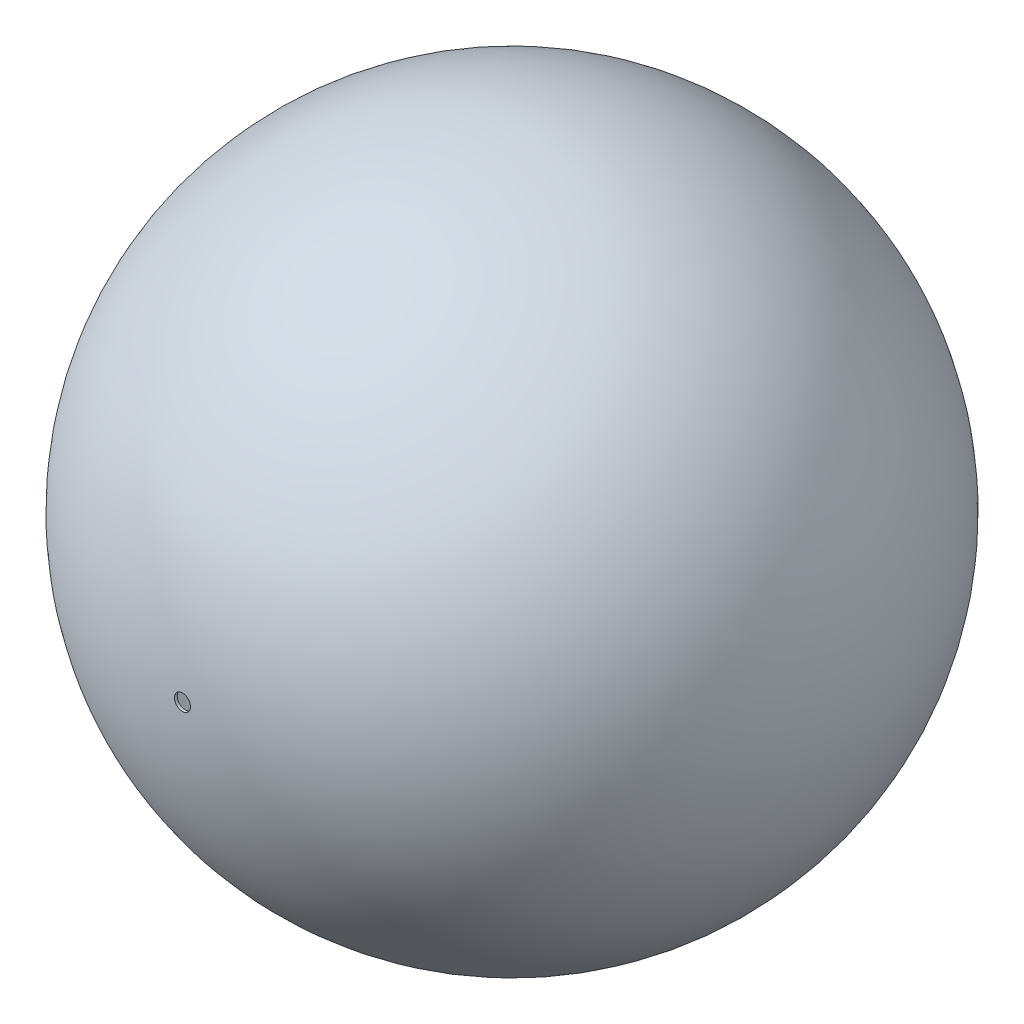
ISO-10303-21;
HEADER;
FILE_DESCRIPTION(('STEP AP214'),'2;1');
FILE_NAME('part.step','',(''),(''),'','','');
FILE_SCHEMA(('AUTOMOTIVE_DESIGN { 1 0 10303 214 1 1 1 1 }'));
ENDSEC;
DATA;
#1=APPLICATION_CONTEXT('core data for automotive mechanical design processes');
#2=APPLICATION_PROTOCOL_DEFINITION('international standard','automotive_design',2000,#1);
#3=PRODUCT_CONTEXT('',#1,'mechanical');
#4=PRODUCT('Part','Part','',(#3));
#5=PRODUCT_RELATED_PRODUCT_CATEGORY('part','',(#4));
#6=PRODUCT_DEFINITION_FORMATION('','',#4);
#7=PRODUCT_DEFINITION_CONTEXT('part definition',#1,'design');
#8=PRODUCT_DEFINITION('design','',#6,#7);
#9=PRODUCT_DEFINITION_SHAPE('','',#8);
#10=(LENGTH_UNIT() NAMED_UNIT(*) SI_UNIT(.MILLI.,.METRE.));
#11=(NAMED_UNIT(*) PLANE_ANGLE_UNIT() SI_UNIT($,.RADIAN.));
#12=(NAMED_UNIT(*) SI_UNIT($,.STERADIAN.) SOLID_ANGLE_UNIT());
#13=UNCERTAINTY_MEASURE_WITH_UNIT(LENGTH_MEASURE(1.E-05),#10,'distance_accuracy_value','');
#14=(GEOMETRIC_REPRESENTATION_CONTEXT(3) GLOBAL_UNCERTAINTY_ASSIGNED_CONTEXT((#13)) GLOBAL_UNIT_ASSIGNED_CONTEXT((#10,
#11,#12)) REPRESENTATION_CONTEXT('',''));
#15=CARTESIAN_POINT('',(0.,0.,0.));
#16=DIRECTION('',(0.,0.,1.));
#17=DIRECTION('',(1.,0.,0.));
#18=AXIS2_PLACEMENT_3D('',#15,#16,#17);
#19=CARTESIAN_POINT('',(0.,0.,0.));
#20=DIRECTION('',(-1.,0.,0.));
#21=DIRECTION('',(0.,1.,0.));
#22=AXIS2_PLACEMENT_3D('',#19,#20,#21);
#23=SPHERICAL_SURFACE('',#22,226.695);
#24=CARTESIAN_POINT('',(0.,0.,0.));
#25=DIRECTION('',(0.,0.,-1.));
#26=DIRECTION('',(0.,1.,0.));
#27=AXIS2_PLACEMENT_3D('',#24,#25,#26);
#28=SPHERICAL_SURFACE('',#27,226.695);
#29=CARTESIAN_POINT('',(0.,-1.58252717378821E-12,226.626898471778));
#30=DIRECTION('',(0.,0.,-1.));
#31=DIRECTION('',(0.,1.,0.));
#32=AXIS2_PLACEMENT_3D('',#29,#30,#31);
#33=CIRCLE('',#32,5.55625);
#34=CARTESIAN_POINT('',(0.,5.55624999999842,226.626898471778));
#35=VERTEX_POINT('',#34);
#36=EDGE_CURVE('E10',#35,#35,#33,.T.);
#37=ORIENTED_EDGE('',*,*,#36,.F.);
#38=EDGE_LOOP('',(#37));
#39=FACE_BOUND('',#38,.T.);
#40=CARTESIAN_POINT('',(0.,-1.58252717378821E-12,-226.626898471778));
#41=DIRECTION('',(0.,0.,-1.));
#42=DIRECTION('',(0.,1.,0.));
#43=AXIS2_PLACEMENT_3D('',#40,#41,#42);
#44=CIRCLE('',#43,5.55625);
#45=CARTESIAN_POINT('',(0.,5.55624999999842,-226.626898471778));
#46=VERTEX_POINT('',#45);
#47=EDGE_CURVE('E54',#46,#46,#44,.T.);
#48=ORIENTED_EDGE('',*,*,#47,.T.);
#49=EDGE_LOOP('',(#48));
#50=FACE_BOUND('',#49,.T.);
#51=ADVANCED_FACE('F43',(#39,#50),#28,.F.);
#52=CARTESIAN_POINT('',(0.,0.,0.));
#53=DIRECTION('',(-1.,0.,0.));
#54=DIRECTION('',(0.,-1.,0.));
#55=AXIS2_PLACEMENT_3D('',#52,#53,#54);
#56=SPHERICAL_SURFACE('',#55,228.6);
#57=CARTESIAN_POINT('',(0.,0.,0.));
#58=DIRECTION('',(0.,0.,-1.));
#59=DIRECTION('',(0.,1.,0.));
#60=AXIS2_PLACEMENT_3D('',#57,#58,#59);
#61=SPHERICAL_SURFACE('',#60,228.6);
#62=CARTESIAN_POINT('',(0.,-1.59583368178546E-12,228.532466152924));
#63=DIRECTION('',(0.,0.,-1.));
#64=DIRECTION('',(0.,1.,0.));
#65=AXIS2_PLACEMENT_3D('',#62,#63,#64);
#66=CIRCLE('',#65,5.55625);
#67=CARTESIAN_POINT('',(0.,5.55624999999841,228.532466152924));
#68=VERTEX_POINT('',#67);
#69=EDGE_CURVE('E47',#68,#68,#66,.F.);
#70=ORIENTED_EDGE('',*,*,#69,.F.);
#71=EDGE_LOOP('',(#70));
#72=FACE_BOUND('',#71,.T.);
#73=CARTESIAN_POINT('',(0.,-1.59583368178546E-12,-228.532466152924));
#74=DIRECTION('',(0.,0.,-1.));
#75=DIRECTION('',(0.,1.,0.));
#76=AXIS2_PLACEMENT_3D('',#73,#74,#75);
#77=CIRCLE('',#76,5.55625);
#78=CARTESIAN_POINT('',(0.,5.55624999999841,-228.532466152924));
#79=VERTEX_POINT('',#78);
#80=EDGE_CURVE('E56',#79,#79,#77,.F.);
#81=ORIENTED_EDGE('',*,*,#80,.T.);
#82=EDGE_LOOP('',(#81));
#83=FACE_BOUND('',#82,.T.);
#84=ADVANCED_FACE('F45',(#72,#83),#61,.T.);
#85=CARTESIAN_POINT('',(0.,0.,-1.55431223447522E-12));
#86=DIRECTION('',(0.,0.,-1.));
#87=DIRECTION('',(0.,1.,0.));
#88=AXIS2_PLACEMENT_3D('',#85,#86,#87);
#89=CYLINDRICAL_SURFACE('',#88,5.55625);
#90=ORIENTED_EDGE('',*,*,#69,.T.);
#91=EDGE_LOOP('',(#90));
#92=FACE_BOUND('',#91,.T.);
#93=ORIENTED_EDGE('',*,*,#36,.T.);
#94=EDGE_LOOP('',(#93));
#95=FACE_BOUND('',#94,.T.);
#96=ADVANCED_FACE('F65',(#92,#95),#89,.F.);
#97=CARTESIAN_POINT('',(0.,0.,1.55431223447522E-12));
#98=DIRECTION('',(0.,0.,1.));
#99=DIRECTION('',(0.,1.,0.));
#100=AXIS2_PLACEMENT_3D('',#97,#98,#99);
#101=CYLINDRICAL_SURFACE('',#100,5.55625);
#102=ORIENTED_EDGE('',*,*,#80,.F.);
#103=EDGE_LOOP('',(#102));
#104=FACE_BOUND('',#103,.T.);
#105=ORIENTED_EDGE('',*,*,#47,.F.);
#106=EDGE_LOOP('',(#105));
#107=FACE_BOUND('',#106,.T.);
#108=ADVANCED_FACE('F63',(#104,#107),#101,.F.);
#109=CLOSED_SHELL('',(#51,#84,#96,#108));
#110=MANIFOLD_SOLID_BREP('B2',#109);
#111=ADVANCED_BREP_SHAPE_REPRESENTATION('',(#18,#110),#14);
#112=SHAPE_DEFINITION_REPRESENTATION(#9,#111);
ENDSEC;
END-ISO-10303-21;
